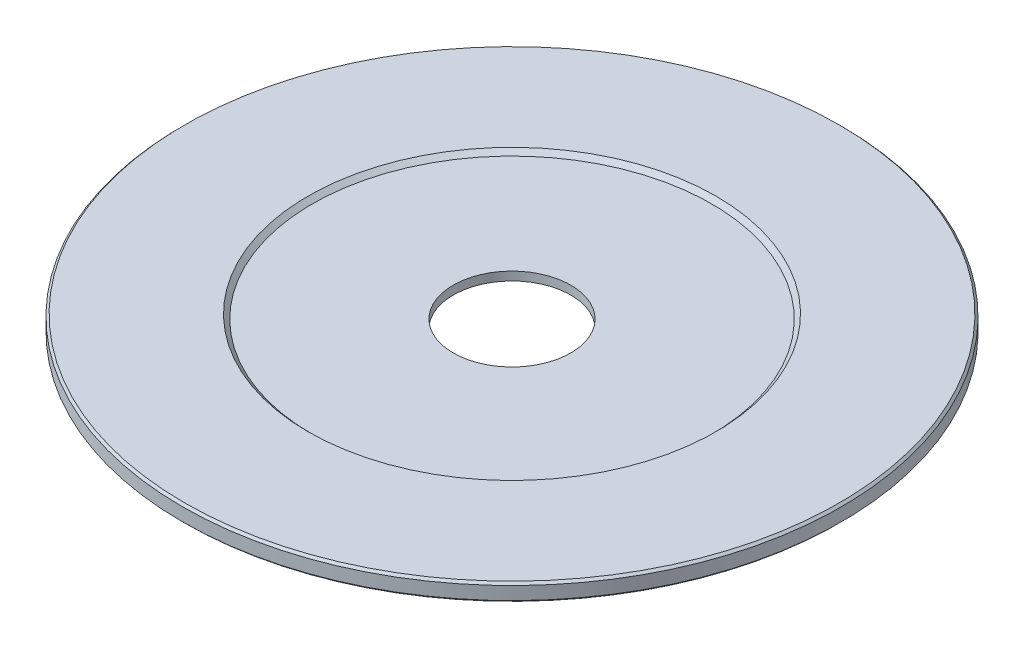
ISO-10303-21;
HEADER;
FILE_DESCRIPTION(('STEP AP214'),'2;1');
FILE_NAME('part.step','',(''),(''),'','','');
FILE_SCHEMA(('AUTOMOTIVE_DESIGN { 1 0 10303 214 1 1 1 1 }'));
ENDSEC;
DATA;
#1=APPLICATION_CONTEXT('core data for automotive mechanical design processes');
#2=APPLICATION_PROTOCOL_DEFINITION('international standard','automotive_design',2000,#1);
#3=PRODUCT_CONTEXT('',#1,'mechanical');
#4=PRODUCT('Part','Part','',(#3));
#5=PRODUCT_RELATED_PRODUCT_CATEGORY('part','',(#4));
#6=PRODUCT_DEFINITION_FORMATION('','',#4);
#7=PRODUCT_DEFINITION_CONTEXT('part definition',#1,'design');
#8=PRODUCT_DEFINITION('design','',#6,#7);
#9=PRODUCT_DEFINITION_SHAPE('','',#8);
#10=(LENGTH_UNIT() NAMED_UNIT(*) SI_UNIT(.MILLI.,.METRE.));
#11=(NAMED_UNIT(*) PLANE_ANGLE_UNIT() SI_UNIT($,.RADIAN.));
#12=(NAMED_UNIT(*) SI_UNIT($,.STERADIAN.) SOLID_ANGLE_UNIT());
#13=UNCERTAINTY_MEASURE_WITH_UNIT(LENGTH_MEASURE(1.E-05),#10,'distance_accuracy_value','');
#14=(GEOMETRIC_REPRESENTATION_CONTEXT(3) GLOBAL_UNCERTAINTY_ASSIGNED_CONTEXT((#13)) GLOBAL_UNIT_ASSIGNED_CONTEXT((#10,
#11,#12)) REPRESENTATION_CONTEXT('',''));
#15=CARTESIAN_POINT('',(0.,0.,0.));
#16=DIRECTION('',(0.,0.,1.));
#17=DIRECTION('',(1.,0.,0.));
#18=AXIS2_PLACEMENT_3D('',#15,#16,#17);
#19=CARTESIAN_POINT('',(-8.65367960057029,13.9443731209816,2.04062946761496));
#20=DIRECTION('',(0.,1.,0.));
#21=DIRECTION('',(0.,0.,1.));
#22=AXIS2_PLACEMENT_3D('',#19,#20,#21);
#23=CYLINDRICAL_SURFACE('',#22,18.8722);
#24=CARTESIAN_POINT('',(-8.65367960057029,3.3443918348289,2.04062946761496));
#25=DIRECTION('',(0.,1.,0.));
#26=DIRECTION('',(0.,0.,1.));
#27=AXIS2_PLACEMENT_3D('',#24,#25,#26);
#28=CIRCLE('',#27,18.8722);
#29=CARTESIAN_POINT('',(-8.65367960057029,3.3443918348289,20.912829467615));
#30=VERTEX_POINT('',#29);
#31=EDGE_CURVE('E29',#30,#30,#28,.T.);
#32=ORIENTED_EDGE('',*,*,#31,.T.);
#33=EDGE_LOOP('',(#32));
#34=FACE_BOUND('',#33,.T.);
#35=CARTESIAN_POINT('',(-8.65367960057029,4.09115183482891,2.04062946761496));
#36=DIRECTION('',(0.,-1.,0.));
#37=DIRECTION('',(0.,0.,-1.));
#38=AXIS2_PLACEMENT_3D('',#35,#36,#37);
#39=CIRCLE('',#38,18.8722);
#40=CARTESIAN_POINT('',(-8.65367960057029,4.09115183482891,-16.831570532385));
#41=VERTEX_POINT('',#40);
#42=EDGE_CURVE('E35',#41,#41,#39,.T.);
#43=ORIENTED_EDGE('',*,*,#42,.T.);
#44=EDGE_LOOP('',(#43));
#45=FACE_BOUND('',#44,.T.);
#46=ADVANCED_FACE('F14',(#34,#45),#23,.T.);
#47=CARTESIAN_POINT('',(10.2185203994297,3.21739183482891,2.04062946761496));
#48=DIRECTION('',(0.,1.,0.));
#49=DIRECTION('',(0.,0.,1.));
#50=AXIS2_PLACEMENT_3D('',#47,#48,#49);
#51=PLANE('',#50);
#52=CARTESIAN_POINT('',(-8.65367960057029,3.21739183482891,2.04062946761496));
#53=DIRECTION('',(0.,1.,0.));
#54=DIRECTION('',(0.,0.,1.));
#55=AXIS2_PLACEMENT_3D('',#52,#53,#54);
#56=CIRCLE('',#55,18.7452);
#57=CARTESIAN_POINT('',(-8.65367960057029,3.21739183482891,20.785829467615));
#58=VERTEX_POINT('',#57);
#59=EDGE_CURVE('E22',#58,#58,#56,.F.);
#60=ORIENTED_EDGE('',*,*,#59,.T.);
#61=EDGE_LOOP('',(#60));
#62=FACE_BOUND('',#61,.T.);
#63=CARTESIAN_POINT('',(-8.65367960057029,3.21739183482891,2.04062946761496));
#64=DIRECTION('',(0.,1.,0.));
#65=DIRECTION('',(0.,0.,1.));
#66=AXIS2_PLACEMENT_3D('',#63,#64,#65);
#67=CIRCLE('',#66,11.684);
#68=CARTESIAN_POINT('',(-8.65367960057029,3.21739183482891,13.724629467615));
#69=VERTEX_POINT('',#68);
#70=EDGE_CURVE('E41',#69,#69,#67,.T.);
#71=ORIENTED_EDGE('',*,*,#70,.T.);
#72=EDGE_LOOP('',(#71));
#73=FACE_BOUND('',#72,.T.);
#74=ADVANCED_FACE('F83',(#62,#73),#51,.F.);
#75=CARTESIAN_POINT('',(-8.65367960057029,3.47139183482891,2.04062946761496));
#76=DIRECTION('',(0.,-1.,0.));
#77=DIRECTION('',(0.,0.,-1.));
#78=AXIS2_PLACEMENT_3D('',#75,#76,#77);
#79=CONICAL_SURFACE('',#78,11.43,0.785398163397448);
#80=ORIENTED_EDGE('',*,*,#70,.F.);
#81=EDGE_LOOP('',(#80));
#82=FACE_BOUND('',#81,.T.);
#83=CARTESIAN_POINT('',(-8.65367960057029,3.47139183482891,2.04062946761496));
#84=DIRECTION('',(0.,1.,0.));
#85=DIRECTION('',(0.,0.,1.));
#86=AXIS2_PLACEMENT_3D('',#83,#84,#85);
#87=CIRCLE('',#86,11.43);
#88=CARTESIAN_POINT('',(-8.65367960057029,3.47139183482891,13.470629467615));
#89=VERTEX_POINT('',#88);
#90=EDGE_CURVE('E45',#89,#89,#87,.T.);
#91=ORIENTED_EDGE('',*,*,#90,.T.);
#92=EDGE_LOOP('',(#91));
#93=FACE_BOUND('',#92,.T.);
#94=ADVANCED_FACE('F89',(#82,#93),#79,.F.);
#95=CARTESIAN_POINT('',(2.77632039942972,3.47139183482891,2.04062946761496));
#96=DIRECTION('',(0.,1.,0.));
#97=DIRECTION('',(0.,0.,1.));
#98=AXIS2_PLACEMENT_3D('',#95,#96,#97);
#99=PLANE('',#98);
#100=ORIENTED_EDGE('',*,*,#90,.F.);
#101=EDGE_LOOP('',(#100));
#102=FACE_BOUND('',#101,.T.);
#103=CARTESIAN_POINT('',(-8.65367960057029,3.47139183482891,2.04062946761496));
#104=DIRECTION('',(0.,1.,0.));
#105=DIRECTION('',(0.,0.,1.));
#106=AXIS2_PLACEMENT_3D('',#103,#104,#105);
#107=CIRCLE('',#106,3.3655);
#108=CARTESIAN_POINT('',(-8.65367960057029,3.47139183482891,5.40612946761496));
#109=VERTEX_POINT('',#108);
#110=EDGE_CURVE('E49',#109,#109,#107,.T.);
#111=ORIENTED_EDGE('',*,*,#110,.T.);
#112=EDGE_LOOP('',(#111));
#113=FACE_BOUND('',#112,.T.);
#114=ADVANCED_FACE('F95',(#102,#113),#99,.F.);
#115=CARTESIAN_POINT('',(-8.65367960057029,13.9443731209816,2.04062946761496));
#116=DIRECTION('',(0.,1.,0.));
#117=DIRECTION('',(0.,0.,1.));
#118=AXIS2_PLACEMENT_3D('',#115,#116,#117);
#119=CYLINDRICAL_SURFACE('',#118,3.3655);
#120=ORIENTED_EDGE('',*,*,#110,.F.);
#121=EDGE_LOOP('',(#120));
#122=FACE_BOUND('',#121,.T.);
#123=CARTESIAN_POINT('',(-8.65367960057029,3.96415183482891,2.04062946761496));
#124=DIRECTION('',(0.,1.,0.));
#125=DIRECTION('',(0.,0.,1.));
#126=AXIS2_PLACEMENT_3D('',#123,#124,#125);
#127=CIRCLE('',#126,3.3655);
#128=CARTESIAN_POINT('',(-8.65367960057029,3.96415183482891,5.40612946761496));
#129=VERTEX_POINT('',#128);
#130=EDGE_CURVE('E53',#129,#129,#127,.T.);
#131=ORIENTED_EDGE('',*,*,#130,.T.);
#132=EDGE_LOOP('',(#131));
#133=FACE_BOUND('',#132,.T.);
#134=ADVANCED_FACE('F99',(#122,#133),#119,.F.);
#135=CARTESIAN_POINT('',(2.77632039942972,3.96415183482891,2.04062946761496));
#136=DIRECTION('',(0.,-1.,0.));
#137=DIRECTION('',(0.,0.,-1.));
#138=AXIS2_PLACEMENT_3D('',#135,#136,#137);
#139=PLANE('',#138);
#140=ORIENTED_EDGE('',*,*,#130,.F.);
#141=EDGE_LOOP('',(#140));
#142=FACE_BOUND('',#141,.T.);
#143=CARTESIAN_POINT('',(-8.65367960057029,3.96415183482891,2.04062946761496));
#144=DIRECTION('',(0.,1.,0.));
#145=DIRECTION('',(0.,0.,1.));
#146=AXIS2_PLACEMENT_3D('',#143,#144,#145);
#147=CIRCLE('',#146,11.43);
#148=CARTESIAN_POINT('',(-8.65367960057029,3.96415183482891,13.470629467615));
#149=VERTEX_POINT('',#148);
#150=EDGE_CURVE('E57',#149,#149,#147,.T.);
#151=ORIENTED_EDGE('',*,*,#150,.T.);
#152=EDGE_LOOP('',(#151));
#153=FACE_BOUND('',#152,.T.);
#154=ADVANCED_FACE('F79',(#142,#153),#139,.F.);
#155=CARTESIAN_POINT('',(-8.65367960057029,4.21815183482891,2.04062946761496));
#156=DIRECTION('',(0.,1.,0.));
#157=DIRECTION('',(0.,0.,1.));
#158=AXIS2_PLACEMENT_3D('',#155,#156,#157);
#159=CONICAL_SURFACE('',#158,11.684,0.785398163397452);
#160=ORIENTED_EDGE('',*,*,#150,.F.);
#161=EDGE_LOOP('',(#160));
#162=FACE_BOUND('',#161,.T.);
#163=CARTESIAN_POINT('',(-8.65367960057029,4.21815183482891,2.04062946761496));
#164=DIRECTION('',(0.,1.,0.));
#165=DIRECTION('',(0.,0.,1.));
#166=AXIS2_PLACEMENT_3D('',#163,#164,#165);
#167=CIRCLE('',#166,11.684);
#168=CARTESIAN_POINT('',(-8.65367960057029,4.21815183482891,13.724629467615));
#169=VERTEX_POINT('',#168);
#170=EDGE_CURVE('E61',#169,#169,#167,.T.);
#171=ORIENTED_EDGE('',*,*,#170,.T.);
#172=EDGE_LOOP('',(#171));
#173=FACE_BOUND('',#172,.T.);
#174=ADVANCED_FACE('F67',(#162,#173),#159,.F.);
#175=CARTESIAN_POINT('',(3.03032039942972,4.21815183482891,2.04062946761496));
#176=DIRECTION('',(0.,-1.,0.));
#177=DIRECTION('',(0.,0.,-1.));
#178=AXIS2_PLACEMENT_3D('',#175,#176,#177);
#179=PLANE('',#178);
#180=CARTESIAN_POINT('',(-8.65367960057029,4.21815183482891,2.04062946761496));
#181=DIRECTION('',(0.,-1.,0.));
#182=DIRECTION('',(0.,0.,-1.));
#183=AXIS2_PLACEMENT_3D('',#180,#181,#182);
#184=CIRCLE('',#183,18.7452);
#185=CARTESIAN_POINT('',(-8.65367960057029,4.21815183482891,-16.704570532385));
#186=VERTEX_POINT('',#185);
#187=EDGE_CURVE('E10',#186,#186,#184,.F.);
#188=ORIENTED_EDGE('',*,*,#187,.T.);
#189=EDGE_LOOP('',(#188));
#190=FACE_BOUND('',#189,.T.);
#191=ORIENTED_EDGE('',*,*,#170,.F.);
#192=EDGE_LOOP('',(#191));
#193=FACE_BOUND('',#192,.T.);
#194=ADVANCED_FACE('F69',(#190,#193),#179,.F.);
#195=CARTESIAN_POINT('',(-8.65367960057029,3.3443918348289,2.04062946761496));
#196=DIRECTION('',(0.,1.,0.));
#197=DIRECTION('',(0.,0.,1.));
#198=AXIS2_PLACEMENT_3D('',#195,#196,#197);
#199=CONICAL_SURFACE('',#198,18.8722,0.785398163397462);
#200=ORIENTED_EDGE('',*,*,#59,.F.);
#201=EDGE_LOOP('',(#200));
#202=FACE_BOUND('',#201,.T.);
#203=ORIENTED_EDGE('',*,*,#31,.F.);
#204=EDGE_LOOP('',(#203));
#205=FACE_BOUND('',#204,.T.);
#206=ADVANCED_FACE('F71',(#202,#205),#199,.T.);
#207=CARTESIAN_POINT('',(-8.65367960057029,4.21815183482891,2.04062946761496));
#208=DIRECTION('',(0.,-1.,0.));
#209=DIRECTION('',(0.,0.,-1.));
#210=AXIS2_PLACEMENT_3D('',#207,#208,#209);
#211=CONICAL_SURFACE('',#210,18.7452,0.785398163397421);
#212=ORIENTED_EDGE('',*,*,#42,.F.);
#213=EDGE_LOOP('',(#212));
#214=FACE_BOUND('',#213,.T.);
#215=ORIENTED_EDGE('',*,*,#187,.F.);
#216=EDGE_LOOP('',(#215));
#217=FACE_BOUND('',#216,.T.);
#218=ADVANCED_FACE('F16',(#214,#217),#211,.T.);
#219=CLOSED_SHELL('',(#46,#74,#94,#114,#134,#154,#174,#194,#206,#218));
#220=MANIFOLD_SOLID_BREP('B1',#219);
#221=ADVANCED_BREP_SHAPE_REPRESENTATION('',(#18,#220),#14);
#222=SHAPE_DEFINITION_REPRESENTATION(#9,#221);
ENDSEC;
END-ISO-10303-21;
